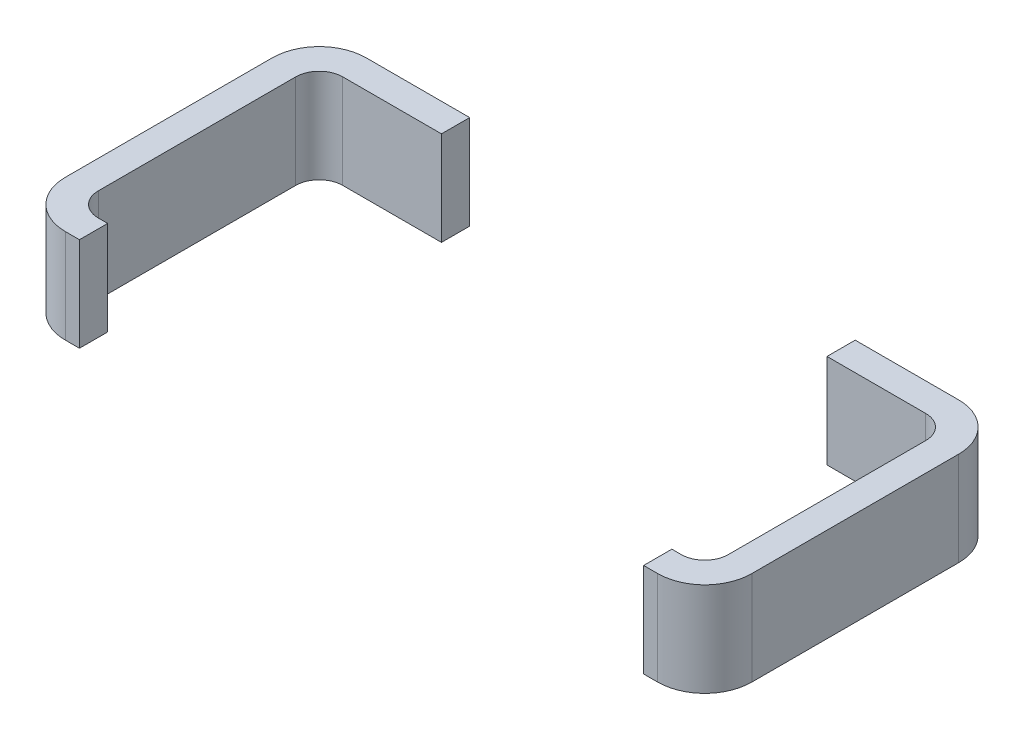
ISO-10303-21;
HEADER;
FILE_DESCRIPTION(('STEP AP214'),'2;1');
FILE_NAME('part.step','',(''),(''),'','','');
FILE_SCHEMA(('AUTOMOTIVE_DESIGN { 1 0 10303 214 1 1 1 1 }'));
ENDSEC;
DATA;
#1=APPLICATION_CONTEXT('core data for automotive mechanical design processes');
#2=APPLICATION_PROTOCOL_DEFINITION('international standard','automotive_design',2000,#1);
#3=PRODUCT_CONTEXT('',#1,'mechanical');
#4=PRODUCT('Part','Part','',(#3));
#5=PRODUCT_RELATED_PRODUCT_CATEGORY('part','',(#4));
#6=PRODUCT_DEFINITION_FORMATION('','',#4);
#7=PRODUCT_DEFINITION_CONTEXT('part definition',#1,'design');
#8=PRODUCT_DEFINITION('design','',#6,#7);
#9=PRODUCT_DEFINITION_SHAPE('','',#8);
#10=(LENGTH_UNIT() NAMED_UNIT(*) SI_UNIT(.MILLI.,.METRE.));
#11=(NAMED_UNIT(*) PLANE_ANGLE_UNIT() SI_UNIT($,.RADIAN.));
#12=(NAMED_UNIT(*) SI_UNIT($,.STERADIAN.) SOLID_ANGLE_UNIT());
#13=UNCERTAINTY_MEASURE_WITH_UNIT(LENGTH_MEASURE(1.E-05),#10,'distance_accuracy_value','');
#14=(GEOMETRIC_REPRESENTATION_CONTEXT(3) GLOBAL_UNCERTAINTY_ASSIGNED_CONTEXT((#13)) GLOBAL_UNIT_ASSIGNED_CONTEXT((#10,
#11,#12)) REPRESENTATION_CONTEXT('',''));
#15=CARTESIAN_POINT('',(0.,0.,0.));
#16=DIRECTION('',(0.,0.,1.));
#17=DIRECTION('',(1.,0.,0.));
#18=AXIS2_PLACEMENT_3D('',#15,#16,#17);
#19=CARTESIAN_POINT('',(-1.825,0.,1.6));
#20=DIRECTION('',(0.,0.,1.));
#21=DIRECTION('',(1.,0.,0.));
#22=AXIS2_PLACEMENT_3D('',#19,#20,#21);
#23=PLANE('',#22);
#24=DIRECTION('',(0.,1.,0.));
#25=VECTOR('',#24,1.);
#26=CARTESIAN_POINT('',(-1.5,0.,1.6));
#27=LINE('',#26,#25);
#28=CARTESIAN_POINT('',(-1.5,0.25,1.6));
#29=VERTEX_POINT('',#28);
#30=CARTESIAN_POINT('',(-1.5,-0.25,1.6));
#31=VERTEX_POINT('',#30);
#32=EDGE_CURVE('P0_E154',#29,#31,#27,.F.);
#33=ORIENTED_EDGE('',*,*,#32,.F.);
#34=DIRECTION('',(1.,0.,0.));
#35=VECTOR('',#34,1.);
#36=CARTESIAN_POINT('',(-1.425,0.25,1.6));
#37=LINE('',#36,#35);
#38=CARTESIAN_POINT('',(-1.575,0.25,1.6));
#39=VERTEX_POINT('',#38);
#40=EDGE_CURVE('P0_E161',#39,#29,#37,.T.);
#41=ORIENTED_EDGE('',*,*,#40,.F.);
#42=DIRECTION('',(0.,1.,0.));
#43=VECTOR('',#42,1.);
#44=CARTESIAN_POINT('',(-1.575,0.,1.6));
#45=LINE('',#44,#43);
#46=CARTESIAN_POINT('',(-1.575,-0.25,1.6));
#47=VERTEX_POINT('',#46);
#48=EDGE_CURVE('P0_E168',#47,#39,#45,.T.);
#49=ORIENTED_EDGE('',*,*,#48,.F.);
#50=DIRECTION('',(1.,0.,0.));
#51=VECTOR('',#50,1.);
#52=CARTESIAN_POINT('',(-1.425,-0.25,1.6));
#53=LINE('',#52,#51);
#54=EDGE_CURVE('P0_E102',#31,#47,#53,.F.);
#55=ORIENTED_EDGE('',*,*,#54,.F.);
#56=EDGE_LOOP('',(#33,#41,#49,#55));
#57=FACE_BOUND('',#56,.T.);
#58=ADVANCED_FACE('P0_F17',(#57),#23,.T.);
#59=CARTESIAN_POINT('',(-1.5,0.,1.6));
#60=DIRECTION('',(1.,0.,0.));
#61=DIRECTION('',(0.,0.,-1.));
#62=AXIS2_PLACEMENT_3D('',#59,#60,#61);
#63=PLANE('',#62);
#64=ORIENTED_EDGE('',*,*,#32,.T.);
#65=DIRECTION('',(0.,0.,-1.));
#66=VECTOR('',#65,1.);
#67=CARTESIAN_POINT('',(-1.5,-0.25,0.8));
#68=LINE('',#67,#66);
#69=CARTESIAN_POINT('',(-1.5,-0.25,1.45));
#70=VERTEX_POINT('',#69);
#71=EDGE_CURVE('P0_E104',#70,#31,#68,.F.);
#72=ORIENTED_EDGE('',*,*,#71,.F.);
#73=DIRECTION('',(0.,1.,0.));
#74=VECTOR('',#73,1.);
#75=CARTESIAN_POINT('',(-1.5,0.,1.45));
#76=LINE('',#75,#74);
#77=CARTESIAN_POINT('',(-1.5,0.25,1.45));
#78=VERTEX_POINT('',#77);
#79=EDGE_CURVE('P0_E151',#78,#70,#76,.F.);
#80=ORIENTED_EDGE('',*,*,#79,.F.);
#81=DIRECTION('',(0.,0.,1.));
#82=VECTOR('',#81,1.);
#83=CARTESIAN_POINT('',(-1.5,0.25,0.8));
#84=LINE('',#83,#82);
#85=EDGE_CURVE('P0_E157',#29,#78,#84,.F.);
#86=ORIENTED_EDGE('',*,*,#85,.F.);
#87=EDGE_LOOP('',(#64,#72,#80,#86));
#88=FACE_BOUND('',#87,.T.);
#89=ADVANCED_FACE('P0_F223',(#88),#63,.T.);
#90=CARTESIAN_POINT('',(-1.5,0.,1.45));
#91=DIRECTION('',(0.,0.,-1.));
#92=DIRECTION('',(-1.,0.,0.));
#93=AXIS2_PLACEMENT_3D('',#90,#91,#92);
#94=PLANE('',#93);
#95=ORIENTED_EDGE('',*,*,#79,.T.);
#96=DIRECTION('',(1.,0.,0.));
#97=VECTOR('',#96,1.);
#98=CARTESIAN_POINT('',(-1.425,-0.25,1.45));
#99=LINE('',#98,#97);
#100=CARTESIAN_POINT('',(-1.55,-0.25,1.45));
#101=VERTEX_POINT('',#100);
#102=EDGE_CURVE('P0_E107',#101,#70,#99,.T.);
#103=ORIENTED_EDGE('',*,*,#102,.F.);
#104=DIRECTION('',(0.,1.,0.));
#105=VECTOR('',#104,1.);
#106=CARTESIAN_POINT('',(-1.55,0.,1.45));
#107=LINE('',#106,#105);
#108=CARTESIAN_POINT('',(-1.55,0.25,1.45));
#109=VERTEX_POINT('',#108);
#110=EDGE_CURVE('P0_E148',#101,#109,#107,.T.);
#111=ORIENTED_EDGE('',*,*,#110,.T.);
#112=DIRECTION('',(1.,0.,0.));
#113=VECTOR('',#112,1.);
#114=CARTESIAN_POINT('',(-1.425,0.25,1.45));
#115=LINE('',#114,#113);
#116=EDGE_CURVE('P0_E160',#78,#109,#115,.F.);
#117=ORIENTED_EDGE('',*,*,#116,.F.);
#118=EDGE_LOOP('',(#95,#103,#111,#117));
#119=FACE_BOUND('',#118,.T.);
#120=ADVANCED_FACE('P0_F215',(#119),#94,.T.);
#121=CARTESIAN_POINT('',(-1.55,0.,1.325));
#122=DIRECTION('',(0.,1.,0.));
#123=DIRECTION('',(0.,0.,1.));
#124=AXIS2_PLACEMENT_3D('',#121,#122,#123);
#125=CYLINDRICAL_SURFACE('',#124,0.125);
#126=DIRECTION('',(0.,1.,0.));
#127=VECTOR('',#126,1.);
#128=CARTESIAN_POINT('',(-1.675,0.,1.325));
#129=LINE('',#128,#127);
#130=CARTESIAN_POINT('',(-1.675,0.25,1.325));
#131=VERTEX_POINT('',#130);
#132=CARTESIAN_POINT('',(-1.675,-0.25,1.325));
#133=VERTEX_POINT('',#132);
#134=EDGE_CURVE('P0_E146',#131,#133,#129,.F.);
#135=ORIENTED_EDGE('',*,*,#134,.F.);
#136=CARTESIAN_POINT('',(-1.55,0.25,1.325));
#137=DIRECTION('',(0.,1.,0.));
#138=DIRECTION('',(0.,0.,1.));
#139=AXIS2_PLACEMENT_3D('',#136,#137,#138);
#140=CIRCLE('',#139,0.125);
#141=EDGE_CURVE('P0_E184',#109,#131,#140,.F.);
#142=ORIENTED_EDGE('',*,*,#141,.F.);
#143=ORIENTED_EDGE('',*,*,#110,.F.);
#144=CARTESIAN_POINT('',(-1.55,-0.25,1.325));
#145=DIRECTION('',(0.,1.,0.));
#146=DIRECTION('',(0.,0.,1.));
#147=AXIS2_PLACEMENT_3D('',#144,#145,#146);
#148=CIRCLE('',#147,0.125);
#149=EDGE_CURVE('P0_E110',#133,#101,#148,.T.);
#150=ORIENTED_EDGE('',*,*,#149,.F.);
#151=EDGE_LOOP('',(#135,#142,#143,#150));
#152=FACE_BOUND('',#151,.T.);
#153=ADVANCED_FACE('P0_F210',(#152),#125,.F.);
#154=CARTESIAN_POINT('',(-1.675,0.,1.45));
#155=DIRECTION('',(1.,0.,0.));
#156=DIRECTION('',(0.,0.,-1.));
#157=AXIS2_PLACEMENT_3D('',#154,#155,#156);
#158=PLANE('',#157);
#159=DIRECTION('',(0.,1.,0.));
#160=VECTOR('',#159,1.);
#161=CARTESIAN_POINT('',(-1.675,0.,0.275));
#162=LINE('',#161,#160);
#163=CARTESIAN_POINT('',(-1.675,-0.25,0.275));
#164=VERTEX_POINT('',#163);
#165=CARTESIAN_POINT('',(-1.675,0.25,0.275));
#166=VERTEX_POINT('',#165);
#167=EDGE_CURVE('P0_E143',#164,#166,#162,.T.);
#168=ORIENTED_EDGE('',*,*,#167,.T.);
#169=DIRECTION('',(0.,0.,1.));
#170=VECTOR('',#169,1.);
#171=CARTESIAN_POINT('',(-1.675,0.25,0.8));
#172=LINE('',#171,#170);
#173=EDGE_CURVE('P0_E183',#131,#166,#172,.F.);
#174=ORIENTED_EDGE('',*,*,#173,.F.);
#175=ORIENTED_EDGE('',*,*,#134,.T.);
#176=DIRECTION('',(0.,0.,-1.));
#177=VECTOR('',#176,1.);
#178=CARTESIAN_POINT('',(-1.675,-0.25,0.8));
#179=LINE('',#178,#177);
#180=EDGE_CURVE('P0_E113',#164,#133,#179,.F.);
#181=ORIENTED_EDGE('',*,*,#180,.F.);
#182=EDGE_LOOP('',(#168,#174,#175,#181));
#183=FACE_BOUND('',#182,.T.);
#184=ADVANCED_FACE('P0_F205',(#183),#158,.T.);
#185=CARTESIAN_POINT('',(-1.55,0.,0.275));
#186=DIRECTION('',(0.,1.,0.));
#187=DIRECTION('',(0.,0.,1.));
#188=AXIS2_PLACEMENT_3D('',#185,#186,#187);
#189=CYLINDRICAL_SURFACE('',#188,0.125);
#190=DIRECTION('',(0.,1.,0.));
#191=VECTOR('',#190,1.);
#192=CARTESIAN_POINT('',(-1.55,0.,0.15));
#193=LINE('',#192,#191);
#194=CARTESIAN_POINT('',(-1.55,0.25,0.15));
#195=VERTEX_POINT('',#194);
#196=CARTESIAN_POINT('',(-1.55,-0.25,0.15));
#197=VERTEX_POINT('',#196);
#198=EDGE_CURVE('P0_E139',#195,#197,#193,.F.);
#199=ORIENTED_EDGE('',*,*,#198,.F.);
#200=CARTESIAN_POINT('',(-1.55,0.25,0.275));
#201=DIRECTION('',(0.,1.,0.));
#202=DIRECTION('',(0.,0.,1.));
#203=AXIS2_PLACEMENT_3D('',#200,#201,#202);
#204=CIRCLE('',#203,0.125);
#205=EDGE_CURVE('P0_E180',#166,#195,#204,.F.);
#206=ORIENTED_EDGE('',*,*,#205,.F.);
#207=ORIENTED_EDGE('',*,*,#167,.F.);
#208=CARTESIAN_POINT('',(-1.55,-0.25,0.275));
#209=DIRECTION('',(0.,1.,0.));
#210=DIRECTION('',(0.,0.,1.));
#211=AXIS2_PLACEMENT_3D('',#208,#209,#210);
#212=CIRCLE('',#211,0.125);
#213=EDGE_CURVE('P0_E116',#197,#164,#212,.T.);
#214=ORIENTED_EDGE('',*,*,#213,.F.);
#215=EDGE_LOOP('',(#199,#206,#207,#214));
#216=FACE_BOUND('',#215,.T.);
#217=ADVANCED_FACE('P0_F197',(#216),#189,.F.);
#218=CARTESIAN_POINT('',(-1.675,0.,0.15));
#219=DIRECTION('',(0.,0.,1.));
#220=DIRECTION('',(1.,0.,0.));
#221=AXIS2_PLACEMENT_3D('',#218,#219,#220);
#222=PLANE('',#221);
#223=DIRECTION('',(0.,1.,0.));
#224=VECTOR('',#223,1.);
#225=CARTESIAN_POINT('',(-1.025,0.,0.15));
#226=LINE('',#225,#224);
#227=CARTESIAN_POINT('',(-1.025,0.25,0.15));
#228=VERTEX_POINT('',#227);
#229=CARTESIAN_POINT('',(-1.025,-0.25,0.15));
#230=VERTEX_POINT('',#229);
#231=EDGE_CURVE('P0_E129',#228,#230,#226,.F.);
#232=ORIENTED_EDGE('',*,*,#231,.F.);
#233=DIRECTION('',(1.,0.,0.));
#234=VECTOR('',#233,1.);
#235=CARTESIAN_POINT('',(-1.425,0.25,0.15));
#236=LINE('',#235,#234);
#237=EDGE_CURVE('P0_E134',#195,#228,#236,.T.);
#238=ORIENTED_EDGE('',*,*,#237,.F.);
#239=ORIENTED_EDGE('',*,*,#198,.T.);
#240=DIRECTION('',(1.,0.,0.));
#241=VECTOR('',#240,1.);
#242=CARTESIAN_POINT('',(-1.425,-0.25,0.15));
#243=LINE('',#242,#241);
#244=EDGE_CURVE('P0_E117',#230,#197,#243,.F.);
#245=ORIENTED_EDGE('',*,*,#244,.F.);
#246=EDGE_LOOP('',(#232,#238,#239,#245));
#247=FACE_BOUND('',#246,.T.);
#248=ADVANCED_FACE('P0_F252',(#247),#222,.T.);
#249=CARTESIAN_POINT('',(-1.025,0.,0.15));
#250=DIRECTION('',(1.,0.,0.));
#251=DIRECTION('',(0.,0.,-1.));
#252=AXIS2_PLACEMENT_3D('',#249,#250,#251);
#253=PLANE('',#252);
#254=ORIENTED_EDGE('',*,*,#231,.T.);
#255=DIRECTION('',(0.,0.,-1.));
#256=VECTOR('',#255,1.);
#257=CARTESIAN_POINT('',(-1.025,-0.25,0.8));
#258=LINE('',#257,#256);
#259=CARTESIAN_POINT('',(-1.025,-0.25,0.));
#260=VERTEX_POINT('',#259);
#261=EDGE_CURVE('P0_E120',#260,#230,#258,.F.);
#262=ORIENTED_EDGE('',*,*,#261,.F.);
#263=DIRECTION('',(0.,1.,0.));
#264=VECTOR('',#263,1.);
#265=CARTESIAN_POINT('',(-1.025,0.,0.));
#266=LINE('',#265,#264);
#267=CARTESIAN_POINT('',(-1.025,0.25,0.));
#268=VERTEX_POINT('',#267);
#269=EDGE_CURVE('P0_E126',#268,#260,#266,.F.);
#270=ORIENTED_EDGE('',*,*,#269,.F.);
#271=DIRECTION('',(0.,0.,1.));
#272=VECTOR('',#271,1.);
#273=CARTESIAN_POINT('',(-1.025,0.25,0.8));
#274=LINE('',#273,#272);
#275=EDGE_CURVE('P0_E98',#228,#268,#274,.F.);
#276=ORIENTED_EDGE('',*,*,#275,.F.);
#277=EDGE_LOOP('',(#254,#262,#270,#276));
#278=FACE_BOUND('',#277,.T.);
#279=ADVANCED_FACE('P0_F267',(#278),#253,.T.);
#280=CARTESIAN_POINT('',(-1.025,0.,0.));
#281=DIRECTION('',(0.,0.,-1.));
#282=DIRECTION('',(-1.,0.,0.));
#283=AXIS2_PLACEMENT_3D('',#280,#281,#282);
#284=PLANE('',#283);
#285=ORIENTED_EDGE('',*,*,#269,.T.);
#286=DIRECTION('',(1.,0.,0.));
#287=VECTOR('',#286,1.);
#288=CARTESIAN_POINT('',(-1.425,-0.25,0.));
#289=LINE('',#288,#287);
#290=CARTESIAN_POINT('',(-1.575,-0.25,0.));
#291=VERTEX_POINT('',#290);
#292=EDGE_CURVE('P0_E85',#291,#260,#289,.T.);
#293=ORIENTED_EDGE('',*,*,#292,.F.);
#294=DIRECTION('',(0.,1.,0.));
#295=VECTOR('',#294,1.);
#296=CARTESIAN_POINT('',(-1.575,0.,0.));
#297=LINE('',#296,#295);
#298=CARTESIAN_POINT('',(-1.575,0.25,0.));
#299=VERTEX_POINT('',#298);
#300=EDGE_CURVE('P0_E81',#299,#291,#297,.F.);
#301=ORIENTED_EDGE('',*,*,#300,.F.);
#302=DIRECTION('',(1.,0.,0.));
#303=VECTOR('',#302,1.);
#304=CARTESIAN_POINT('',(-1.425,0.25,0.));
#305=LINE('',#304,#303);
#306=EDGE_CURVE('P0_E95',#268,#299,#305,.F.);
#307=ORIENTED_EDGE('',*,*,#306,.F.);
#308=EDGE_LOOP('',(#285,#293,#301,#307));
#309=FACE_BOUND('',#308,.T.);
#310=ADVANCED_FACE('P0_F265',(#309),#284,.T.);
#311=CARTESIAN_POINT('',(-1.575,0.,0.25));
#312=DIRECTION('',(0.,1.,0.));
#313=DIRECTION('',(0.,0.,1.));
#314=AXIS2_PLACEMENT_3D('',#311,#312,#313);
#315=CYLINDRICAL_SURFACE('',#314,0.25);
#316=CARTESIAN_POINT('',(-1.575,-0.25,0.25));
#317=DIRECTION('',(0.,1.,0.));
#318=DIRECTION('',(0.,0.,1.));
#319=AXIS2_PLACEMENT_3D('',#316,#317,#318);
#320=CIRCLE('',#319,0.25);
#321=CARTESIAN_POINT('',(-1.825,-0.25,0.25));
#322=VERTEX_POINT('',#321);
#323=EDGE_CURVE('P0_E20',#322,#291,#320,.F.);
#324=ORIENTED_EDGE('',*,*,#323,.F.);
#325=DIRECTION('',(0.,1.,0.));
#326=VECTOR('',#325,1.);
#327=CARTESIAN_POINT('',(-1.825,0.,0.25));
#328=LINE('',#327,#326);
#329=CARTESIAN_POINT('',(-1.825,0.25,0.25));
#330=VERTEX_POINT('',#329);
#331=EDGE_CURVE('P0_E79',#330,#322,#328,.F.);
#332=ORIENTED_EDGE('',*,*,#331,.F.);
#333=CARTESIAN_POINT('',(-1.575,0.25,0.25));
#334=DIRECTION('',(0.,1.,0.));
#335=DIRECTION('',(0.,0.,1.));
#336=AXIS2_PLACEMENT_3D('',#333,#334,#335);
#337=CIRCLE('',#336,0.25);
#338=EDGE_CURVE('P0_E170',#299,#330,#337,.T.);
#339=ORIENTED_EDGE('',*,*,#338,.F.);
#340=ORIENTED_EDGE('',*,*,#300,.T.);
#341=EDGE_LOOP('',(#324,#332,#339,#340));
#342=FACE_BOUND('',#341,.T.);
#343=ADVANCED_FACE('P0_F76',(#342),#315,.T.);
#344=CARTESIAN_POINT('',(-1.425,-0.25,0.8));
#345=DIRECTION('',(0.,-1.,0.));
#346=DIRECTION('',(0.,0.,-1.));
#347=AXIS2_PLACEMENT_3D('',#344,#345,#346);
#348=PLANE('',#347);
#349=CARTESIAN_POINT('',(-1.575,-0.25,1.35));
#350=DIRECTION('',(0.,1.,0.));
#351=DIRECTION('',(0.,0.,1.));
#352=AXIS2_PLACEMENT_3D('',#349,#350,#351);
#353=CIRCLE('',#352,0.25);
#354=CARTESIAN_POINT('',(-1.825,-0.25,1.35));
#355=VERTEX_POINT('',#354);
#356=EDGE_CURVE('P0_E90',#355,#47,#353,.T.);
#357=ORIENTED_EDGE('',*,*,#356,.F.);
#358=DIRECTION('',(0.,0.,1.));
#359=VECTOR('',#358,1.);
#360=CARTESIAN_POINT('',(-1.825,-0.25,0.));
#361=LINE('',#360,#359);
#362=EDGE_CURVE('P0_E87',#322,#355,#361,.T.);
#363=ORIENTED_EDGE('',*,*,#362,.F.);
#364=ORIENTED_EDGE('',*,*,#323,.T.);
#365=ORIENTED_EDGE('',*,*,#292,.T.);
#366=ORIENTED_EDGE('',*,*,#261,.T.);
#367=ORIENTED_EDGE('',*,*,#244,.T.);
#368=ORIENTED_EDGE('',*,*,#213,.T.);
#369=ORIENTED_EDGE('',*,*,#180,.T.);
#370=ORIENTED_EDGE('',*,*,#149,.T.);
#371=ORIENTED_EDGE('',*,*,#102,.T.);
#372=ORIENTED_EDGE('',*,*,#71,.T.);
#373=ORIENTED_EDGE('',*,*,#54,.T.);
#374=EDGE_LOOP('',(#357,#363,#364,#365,#366,#367,#368,#369,#370,#371,#372,#373));
#375=FACE_BOUND('',#374,.T.);
#376=ADVANCED_FACE('P0_F88',(#375),#348,.T.);
#377=CARTESIAN_POINT('',(-1.575,0.,1.35));
#378=DIRECTION('',(0.,1.,0.));
#379=DIRECTION('',(0.,0.,1.));
#380=AXIS2_PLACEMENT_3D('',#377,#378,#379);
#381=CYLINDRICAL_SURFACE('',#380,0.25);
#382=ORIENTED_EDGE('',*,*,#356,.T.);
#383=ORIENTED_EDGE('',*,*,#48,.T.);
#384=CARTESIAN_POINT('',(-1.575,0.25,1.35));
#385=DIRECTION('',(0.,1.,0.));
#386=DIRECTION('',(0.,0.,1.));
#387=AXIS2_PLACEMENT_3D('',#384,#385,#386);
#388=CIRCLE('',#387,0.25);
#389=CARTESIAN_POINT('',(-1.825,0.25,1.35));
#390=VERTEX_POINT('',#389);
#391=EDGE_CURVE('P0_E35',#390,#39,#388,.T.);
#392=ORIENTED_EDGE('',*,*,#391,.F.);
#393=DIRECTION('',(0.,1.,0.));
#394=VECTOR('',#393,1.);
#395=CARTESIAN_POINT('',(-1.825,0.,1.35));
#396=LINE('',#395,#394);
#397=EDGE_CURVE('P0_E26',#355,#390,#396,.T.);
#398=ORIENTED_EDGE('',*,*,#397,.F.);
#399=EDGE_LOOP('',(#382,#383,#392,#398));
#400=FACE_BOUND('',#399,.T.);
#401=ADVANCED_FACE('P0_F231',(#400),#381,.T.);
#402=CARTESIAN_POINT('',(-1.425,0.25,0.8));
#403=DIRECTION('',(0.,1.,0.));
#404=DIRECTION('',(0.,0.,1.));
#405=AXIS2_PLACEMENT_3D('',#402,#403,#404);
#406=PLANE('',#405);
#407=ORIENTED_EDGE('',*,*,#275,.T.);
#408=ORIENTED_EDGE('',*,*,#306,.T.);
#409=ORIENTED_EDGE('',*,*,#338,.T.);
#410=DIRECTION('',(0.,0.,1.));
#411=VECTOR('',#410,1.);
#412=CARTESIAN_POINT('',(-1.825,0.25,0.));
#413=LINE('',#412,#411);
#414=EDGE_CURVE('P0_E11',#390,#330,#413,.F.);
#415=ORIENTED_EDGE('',*,*,#414,.F.);
#416=ORIENTED_EDGE('',*,*,#391,.T.);
#417=ORIENTED_EDGE('',*,*,#40,.T.);
#418=ORIENTED_EDGE('',*,*,#85,.T.);
#419=ORIENTED_EDGE('',*,*,#116,.T.);
#420=ORIENTED_EDGE('',*,*,#141,.T.);
#421=ORIENTED_EDGE('',*,*,#173,.T.);
#422=ORIENTED_EDGE('',*,*,#205,.T.);
#423=ORIENTED_EDGE('',*,*,#237,.T.);
#424=EDGE_LOOP('',(#407,#408,#409,#415,#416,#417,#418,#419,#420,#421,#422,#423));
#425=FACE_BOUND('',#424,.T.);
#426=ADVANCED_FACE('P0_F247',(#425),#406,.T.);
#427=CARTESIAN_POINT('',(-1.825,0.,0.));
#428=DIRECTION('',(-1.,0.,0.));
#429=DIRECTION('',(0.,0.,1.));
#430=AXIS2_PLACEMENT_3D('',#427,#428,#429);
#431=PLANE('',#430);
#432=ORIENTED_EDGE('',*,*,#397,.T.);
#433=ORIENTED_EDGE('',*,*,#414,.T.);
#434=ORIENTED_EDGE('',*,*,#331,.T.);
#435=ORIENTED_EDGE('',*,*,#362,.T.);
#436=EDGE_LOOP('',(#432,#433,#434,#435));
#437=FACE_BOUND('',#436,.T.);
#438=ADVANCED_FACE('P0_F94',(#437),#431,.T.);
#439=CLOSED_SHELL('',(#58,#89,#120,#153,#184,#217,#248,#279,#310,#343,#376,#401,#426,#438));
#440=MANIFOLD_SOLID_BREP('P0_B1',#439);
#441=CARTESIAN_POINT('',(1.825,0.,1.6));
#442=DIRECTION('',(0.,0.,-1.));
#443=DIRECTION('',(-1.,0.,0.));
#444=AXIS2_PLACEMENT_3D('',#441,#442,#443);
#445=PLANE('',#444);
#446=DIRECTION('',(1.,0.,0.));
#447=VECTOR('',#446,1.);
#448=CARTESIAN_POINT('',(1.425,0.25,1.6));
#449=LINE('',#448,#447);
#450=CARTESIAN_POINT('',(1.575,0.25,1.6));
#451=VERTEX_POINT('',#450);
#452=CARTESIAN_POINT('',(1.5,0.25,1.6));
#453=VERTEX_POINT('',#452);
#454=EDGE_CURVE('P1_E163',#451,#453,#449,.F.);
#455=ORIENTED_EDGE('',*,*,#454,.T.);
#456=DIRECTION('',(0.,1.,0.));
#457=VECTOR('',#456,1.);
#458=CARTESIAN_POINT('',(1.5,0.,1.6));
#459=LINE('',#458,#457);
#460=CARTESIAN_POINT('',(1.5,-0.25,1.6));
#461=VERTEX_POINT('',#460);
#462=EDGE_CURVE('P1_E156',#453,#461,#459,.F.);
#463=ORIENTED_EDGE('',*,*,#462,.T.);
#464=DIRECTION('',(1.,0.,0.));
#465=VECTOR('',#464,1.);
#466=CARTESIAN_POINT('',(1.425,-0.25,1.6));
#467=LINE('',#466,#465);
#468=CARTESIAN_POINT('',(1.575,-0.25,1.6));
#469=VERTEX_POINT('',#468);
#470=EDGE_CURVE('P1_E172',#461,#469,#467,.T.);
#471=ORIENTED_EDGE('',*,*,#470,.T.);
#472=DIRECTION('',(0.,-1.,0.));
#473=VECTOR('',#472,1.);
#474=CARTESIAN_POINT('',(1.575,0.,1.6));
#475=LINE('',#474,#473);
#476=EDGE_CURVE('P1_E169',#451,#469,#475,.T.);
#477=ORIENTED_EDGE('',*,*,#476,.F.);
#478=EDGE_LOOP('',(#455,#463,#471,#477));
#479=FACE_BOUND('',#478,.T.);
#480=ADVANCED_FACE('P1_F17',(#479),#445,.F.);
#481=CARTESIAN_POINT('',(1.5,0.,1.6));
#482=DIRECTION('',(1.,0.,0.));
#483=DIRECTION('',(0.,0.,-1.));
#484=AXIS2_PLACEMENT_3D('',#481,#482,#483);
#485=PLANE('',#484);
#486=DIRECTION('',(0.,0.,1.));
#487=VECTOR('',#486,1.);
#488=CARTESIAN_POINT('',(1.5,-0.25,0.8));
#489=LINE('',#488,#487);
#490=CARTESIAN_POINT('',(1.5,-0.25,1.45));
#491=VERTEX_POINT('',#490);
#492=EDGE_CURVE('P1_E173',#491,#461,#489,.T.);
#493=ORIENTED_EDGE('',*,*,#492,.T.);
#494=ORIENTED_EDGE('',*,*,#462,.F.);
#495=DIRECTION('',(0.,0.,-1.));
#496=VECTOR('',#495,1.);
#497=CARTESIAN_POINT('',(1.5,0.25,0.8));
#498=LINE('',#497,#496);
#499=CARTESIAN_POINT('',(1.5,0.25,1.45));
#500=VERTEX_POINT('',#499);
#501=EDGE_CURVE('P1_E159',#453,#500,#498,.T.);
#502=ORIENTED_EDGE('',*,*,#501,.T.);
#503=DIRECTION('',(0.,1.,0.));
#504=VECTOR('',#503,1.);
#505=CARTESIAN_POINT('',(1.5,0.,1.45));
#506=LINE('',#505,#504);
#507=EDGE_CURVE('P1_E154',#500,#491,#506,.F.);
#508=ORIENTED_EDGE('',*,*,#507,.T.);
#509=EDGE_LOOP('',(#493,#494,#502,#508));
#510=FACE_BOUND('',#509,.T.);
#511=ADVANCED_FACE('P1_F263',(#510),#485,.F.);
#512=CARTESIAN_POINT('',(1.5,0.,1.45));
#513=DIRECTION('',(0.,0.,1.));
#514=DIRECTION('',(1.,0.,0.));
#515=AXIS2_PLACEMENT_3D('',#512,#513,#514);
#516=PLANE('',#515);
#517=DIRECTION('',(1.,0.,0.));
#518=VECTOR('',#517,1.);
#519=CARTESIAN_POINT('',(1.425,-0.25,1.45));
#520=LINE('',#519,#518);
#521=CARTESIAN_POINT('',(1.55,-0.25,1.45));
#522=VERTEX_POINT('',#521);
#523=EDGE_CURVE('P1_E176',#522,#491,#520,.F.);
#524=ORIENTED_EDGE('',*,*,#523,.T.);
#525=ORIENTED_EDGE('',*,*,#507,.F.);
#526=DIRECTION('',(1.,0.,0.));
#527=VECTOR('',#526,1.);
#528=CARTESIAN_POINT('',(1.425,0.25,1.45));
#529=LINE('',#528,#527);
#530=CARTESIAN_POINT('',(1.55,0.25,1.45));
#531=VERTEX_POINT('',#530);
#532=EDGE_CURVE('P1_E162',#500,#531,#529,.T.);
#533=ORIENTED_EDGE('',*,*,#532,.T.);
#534=DIRECTION('',(0.,-1.,0.));
#535=VECTOR('',#534,1.);
#536=CARTESIAN_POINT('',(1.55,0.,1.45));
#537=LINE('',#536,#535);
#538=EDGE_CURVE('P1_E152',#531,#522,#537,.T.);
#539=ORIENTED_EDGE('',*,*,#538,.T.);
#540=EDGE_LOOP('',(#524,#525,#533,#539));
#541=FACE_BOUND('',#540,.T.);
#542=ADVANCED_FACE('P1_F261',(#541),#516,.F.);
#543=CARTESIAN_POINT('',(1.55,0.,1.325));
#544=DIRECTION('',(0.,-1.,0.));
#545=DIRECTION('',(0.,0.,-1.));
#546=AXIS2_PLACEMENT_3D('',#543,#544,#545);
#547=CYLINDRICAL_SURFACE('',#546,0.125);
#548=ORIENTED_EDGE('',*,*,#538,.F.);
#549=CARTESIAN_POINT('',(1.55,0.25,1.325));
#550=DIRECTION('',(0.,-1.,0.));
#551=DIRECTION('',(0.,0.,-1.));
#552=AXIS2_PLACEMENT_3D('',#549,#550,#551);
#553=CIRCLE('',#552,0.125);
#554=CARTESIAN_POINT('',(1.675,0.25,1.325));
#555=VERTEX_POINT('',#554);
#556=EDGE_CURVE('P1_E190',#531,#555,#553,.F.);
#557=ORIENTED_EDGE('',*,*,#556,.T.);
#558=DIRECTION('',(0.,1.,0.));
#559=VECTOR('',#558,1.);
#560=CARTESIAN_POINT('',(1.675,0.,1.325));
#561=LINE('',#560,#559);
#562=CARTESIAN_POINT('',(1.675,-0.25,1.325));
#563=VERTEX_POINT('',#562);
#564=EDGE_CURVE('P1_E150',#555,#563,#561,.F.);
#565=ORIENTED_EDGE('',*,*,#564,.T.);
#566=CARTESIAN_POINT('',(1.55,-0.25,1.325));
#567=DIRECTION('',(0.,-1.,0.));
#568=DIRECTION('',(0.,0.,-1.));
#569=AXIS2_PLACEMENT_3D('',#566,#567,#568);
#570=CIRCLE('',#569,0.125);
#571=EDGE_CURVE('P1_E196',#563,#522,#570,.T.);
#572=ORIENTED_EDGE('',*,*,#571,.T.);
#573=EDGE_LOOP('',(#548,#557,#565,#572));
#574=FACE_BOUND('',#573,.T.);
#575=ADVANCED_FACE('P1_F258',(#574),#547,.F.);
#576=CARTESIAN_POINT('',(1.675,0.,1.45));
#577=DIRECTION('',(1.,0.,0.));
#578=DIRECTION('',(0.,0.,-1.));
#579=AXIS2_PLACEMENT_3D('',#576,#577,#578);
#580=PLANE('',#579);
#581=DIRECTION('',(0.,0.,-1.));
#582=VECTOR('',#581,1.);
#583=CARTESIAN_POINT('',(1.675,0.25,0.8));
#584=LINE('',#583,#582);
#585=CARTESIAN_POINT('',(1.675,0.25,0.275));
#586=VERTEX_POINT('',#585);
#587=EDGE_CURVE('P1_E189',#555,#586,#584,.T.);
#588=ORIENTED_EDGE('',*,*,#587,.T.);
#589=DIRECTION('',(0.,-1.,0.));
#590=VECTOR('',#589,1.);
#591=CARTESIAN_POINT('',(1.675,0.,0.275));
#592=LINE('',#591,#590);
#593=CARTESIAN_POINT('',(1.675,-0.25,0.275));
#594=VERTEX_POINT('',#593);
#595=EDGE_CURVE('P1_E148',#586,#594,#592,.T.);
#596=ORIENTED_EDGE('',*,*,#595,.T.);
#597=DIRECTION('',(0.,0.,1.));
#598=VECTOR('',#597,1.);
#599=CARTESIAN_POINT('',(1.675,-0.25,0.8));
#600=LINE('',#599,#598);
#601=EDGE_CURVE('P1_E198',#594,#563,#600,.T.);
#602=ORIENTED_EDGE('',*,*,#601,.T.);
#603=ORIENTED_EDGE('',*,*,#564,.F.);
#604=EDGE_LOOP('',(#588,#596,#602,#603));
#605=FACE_BOUND('',#604,.T.);
#606=ADVANCED_FACE('P1_F254',(#605),#580,.F.);
#607=CARTESIAN_POINT('',(1.55,0.,0.275));
#608=DIRECTION('',(0.,-1.,0.));
#609=DIRECTION('',(0.,0.,-1.));
#610=AXIS2_PLACEMENT_3D('',#607,#608,#609);
#611=CYLINDRICAL_SURFACE('',#610,0.125);
#612=ORIENTED_EDGE('',*,*,#595,.F.);
#613=CARTESIAN_POINT('',(1.55,0.25,0.275));
#614=DIRECTION('',(0.,-1.,0.));
#615=DIRECTION('',(0.,0.,-1.));
#616=AXIS2_PLACEMENT_3D('',#613,#614,#615);
#617=CIRCLE('',#616,0.125);
#618=CARTESIAN_POINT('',(1.55,0.25,0.15));
#619=VERTEX_POINT('',#618);
#620=EDGE_CURVE('P1_E137',#586,#619,#617,.F.);
#621=ORIENTED_EDGE('',*,*,#620,.T.);
#622=DIRECTION('',(0.,1.,0.));
#623=VECTOR('',#622,1.);
#624=CARTESIAN_POINT('',(1.55,0.,0.15));
#625=LINE('',#624,#623);
#626=CARTESIAN_POINT('',(1.55,-0.25,0.15));
#627=VERTEX_POINT('',#626);
#628=EDGE_CURVE('P1_E80',#619,#627,#625,.F.);
#629=ORIENTED_EDGE('',*,*,#628,.T.);
#630=CARTESIAN_POINT('',(1.55,-0.25,0.275));
#631=DIRECTION('',(0.,-1.,0.));
#632=DIRECTION('',(0.,0.,-1.));
#633=AXIS2_PLACEMENT_3D('',#630,#631,#632);
#634=CIRCLE('',#633,0.125);
#635=EDGE_CURVE('P1_E20',#627,#594,#634,.T.);
#636=ORIENTED_EDGE('',*,*,#635,.T.);
#637=EDGE_LOOP('',(#612,#621,#629,#636));
#638=FACE_BOUND('',#637,.T.);
#639=ADVANCED_FACE('P1_F293',(#638),#611,.F.);
#640=CARTESIAN_POINT('',(1.675,0.,0.15));
#641=DIRECTION('',(0.,0.,-1.));
#642=DIRECTION('',(-1.,0.,0.));
#643=AXIS2_PLACEMENT_3D('',#640,#641,#642);
#644=PLANE('',#643);
#645=DIRECTION('',(1.,0.,0.));
#646=VECTOR('',#645,1.);
#647=CARTESIAN_POINT('',(1.425,0.25,0.15));
#648=LINE('',#647,#646);
#649=CARTESIAN_POINT('',(1.025,0.25,0.15));
#650=VERTEX_POINT('',#649);
#651=EDGE_CURVE('P1_E135',#619,#650,#648,.F.);
#652=ORIENTED_EDGE('',*,*,#651,.T.);
#653=DIRECTION('',(0.,1.,0.));
#654=VECTOR('',#653,1.);
#655=CARTESIAN_POINT('',(1.025,0.,0.15));
#656=LINE('',#655,#654);
#657=CARTESIAN_POINT('',(1.025,-0.25,0.15));
#658=VERTEX_POINT('',#657);
#659=EDGE_CURVE('P1_E90',#650,#658,#656,.F.);
#660=ORIENTED_EDGE('',*,*,#659,.T.);
#661=DIRECTION('',(1.,0.,0.));
#662=VECTOR('',#661,1.);
#663=CARTESIAN_POINT('',(1.425,-0.25,0.15));
#664=LINE('',#663,#662);
#665=EDGE_CURVE('P1_E181',#658,#627,#664,.T.);
#666=ORIENTED_EDGE('',*,*,#665,.T.);
#667=ORIENTED_EDGE('',*,*,#628,.F.);
#668=EDGE_LOOP('',(#652,#660,#666,#667));
#669=FACE_BOUND('',#668,.T.);
#670=ADVANCED_FACE('P1_F290',(#669),#644,.F.);
#671=CARTESIAN_POINT('',(1.025,0.,0.15));
#672=DIRECTION('',(1.,0.,0.));
#673=DIRECTION('',(0.,0.,-1.));
#674=AXIS2_PLACEMENT_3D('',#671,#672,#673);
#675=PLANE('',#674);
#676=DIRECTION('',(0.,0.,1.));
#677=VECTOR('',#676,1.);
#678=CARTESIAN_POINT('',(1.025,-0.25,0.8));
#679=LINE('',#678,#677);
#680=CARTESIAN_POINT('',(1.025,-0.25,0.));
#681=VERTEX_POINT('',#680);
#682=EDGE_CURVE('P1_E179',#681,#658,#679,.T.);
#683=ORIENTED_EDGE('',*,*,#682,.T.);
#684=ORIENTED_EDGE('',*,*,#659,.F.);
#685=DIRECTION('',(0.,0.,-1.));
#686=VECTOR('',#685,1.);
#687=CARTESIAN_POINT('',(1.025,0.25,0.8));
#688=LINE('',#687,#686);
#689=CARTESIAN_POINT('',(1.025,0.25,0.));
#690=VERTEX_POINT('',#689);
#691=EDGE_CURVE('P1_E131',#650,#690,#688,.T.);
#692=ORIENTED_EDGE('',*,*,#691,.T.);
#693=DIRECTION('',(0.,1.,0.));
#694=VECTOR('',#693,1.);
#695=CARTESIAN_POINT('',(1.025,0.,0.));
#696=LINE('',#695,#694);
#697=EDGE_CURVE('P1_E121',#690,#681,#696,.F.);
#698=ORIENTED_EDGE('',*,*,#697,.T.);
#699=EDGE_LOOP('',(#683,#684,#692,#698));
#700=FACE_BOUND('',#699,.T.);
#701=ADVANCED_FACE('P1_F134',(#700),#675,.F.);
#702=CARTESIAN_POINT('',(1.025,0.,0.));
#703=DIRECTION('',(0.,0.,1.));
#704=DIRECTION('',(1.,0.,0.));
#705=AXIS2_PLACEMENT_3D('',#702,#703,#704);
#706=PLANE('',#705);
#707=DIRECTION('',(1.,0.,0.));
#708=VECTOR('',#707,1.);
#709=CARTESIAN_POINT('',(1.425,-0.25,0.));
#710=LINE('',#709,#708);
#711=CARTESIAN_POINT('',(1.575,-0.25,0.));
#712=VERTEX_POINT('',#711);
#713=EDGE_CURVE('P1_E113',#712,#681,#710,.F.);
#714=ORIENTED_EDGE('',*,*,#713,.T.);
#715=ORIENTED_EDGE('',*,*,#697,.F.);
#716=DIRECTION('',(1.,0.,0.));
#717=VECTOR('',#716,1.);
#718=CARTESIAN_POINT('',(1.425,0.25,0.));
#719=LINE('',#718,#717);
#720=CARTESIAN_POINT('',(1.575,0.25,0.));
#721=VERTEX_POINT('',#720);
#722=EDGE_CURVE('P1_E120',#690,#721,#719,.T.);
#723=ORIENTED_EDGE('',*,*,#722,.T.);
#724=DIRECTION('',(0.,-1.,0.));
#725=VECTOR('',#724,1.);
#726=CARTESIAN_POINT('',(1.575,0.,0.));
#727=LINE('',#726,#725);
#728=EDGE_CURVE('P1_E186',#712,#721,#727,.F.);
#729=ORIENTED_EDGE('',*,*,#728,.F.);
#730=EDGE_LOOP('',(#714,#715,#723,#729));
#731=FACE_BOUND('',#730,.T.);
#732=ADVANCED_FACE('P1_F122',(#731),#706,.F.);
#733=CARTESIAN_POINT('',(1.425,-0.25,0.8));
#734=DIRECTION('',(0.,1.,0.));
#735=DIRECTION('',(0.,0.,1.));
#736=AXIS2_PLACEMENT_3D('',#733,#734,#735);
#737=PLANE('',#736);
#738=DIRECTION('',(0.,0.,1.));
#739=VECTOR('',#738,1.);
#740=CARTESIAN_POINT('',(1.825,-0.25,0.));
#741=LINE('',#740,#739);
#742=CARTESIAN_POINT('',(1.825,-0.25,0.25));
#743=VERTEX_POINT('',#742);
#744=CARTESIAN_POINT('',(1.825,-0.25,1.35));
#745=VERTEX_POINT('',#744);
#746=EDGE_CURVE('P1_E216',#743,#745,#741,.T.);
#747=ORIENTED_EDGE('',*,*,#746,.T.);
#748=CARTESIAN_POINT('',(1.575,-0.25,1.35));
#749=DIRECTION('',(0.,-1.,0.));
#750=DIRECTION('',(0.,0.,-1.));
#751=AXIS2_PLACEMENT_3D('',#748,#749,#750);
#752=CIRCLE('',#751,0.25);
#753=EDGE_CURVE('P1_E171',#469,#745,#752,.F.);
#754=ORIENTED_EDGE('',*,*,#753,.F.);
#755=ORIENTED_EDGE('',*,*,#470,.F.);
#756=ORIENTED_EDGE('',*,*,#492,.F.);
#757=ORIENTED_EDGE('',*,*,#523,.F.);
#758=ORIENTED_EDGE('',*,*,#571,.F.);
#759=ORIENTED_EDGE('',*,*,#601,.F.);
#760=ORIENTED_EDGE('',*,*,#635,.F.);
#761=ORIENTED_EDGE('',*,*,#665,.F.);
#762=ORIENTED_EDGE('',*,*,#682,.F.);
#763=ORIENTED_EDGE('',*,*,#713,.F.);
#764=CARTESIAN_POINT('',(1.575,-0.25,0.25));
#765=DIRECTION('',(0.,-1.,0.));
#766=DIRECTION('',(0.,0.,-1.));
#767=AXIS2_PLACEMENT_3D('',#764,#765,#766);
#768=CIRCLE('',#767,0.25);
#769=EDGE_CURVE('P1_E184',#743,#712,#768,.F.);
#770=ORIENTED_EDGE('',*,*,#769,.F.);
#771=EDGE_LOOP('',(#747,#754,#755,#756,#757,#758,#759,#760,#761,#762,#763,#770));
#772=FACE_BOUND('',#771,.T.);
#773=ADVANCED_FACE('P1_F233',(#772),#737,.F.);
#774=CARTESIAN_POINT('',(1.575,0.,1.35));
#775=DIRECTION('',(0.,-1.,0.));
#776=DIRECTION('',(0.,0.,-1.));
#777=AXIS2_PLACEMENT_3D('',#774,#775,#776);
#778=CYLINDRICAL_SURFACE('',#777,0.25);
#779=ORIENTED_EDGE('',*,*,#753,.T.);
#780=DIRECTION('',(0.,1.,0.));
#781=VECTOR('',#780,1.);
#782=CARTESIAN_POINT('',(1.825,0.,1.35));
#783=LINE('',#782,#781);
#784=CARTESIAN_POINT('',(1.825,0.25,1.35));
#785=VERTEX_POINT('',#784);
#786=EDGE_CURVE('P1_E218',#745,#785,#783,.T.);
#787=ORIENTED_EDGE('',*,*,#786,.T.);
#788=CARTESIAN_POINT('',(1.575,0.25,1.35));
#789=DIRECTION('',(0.,-1.,0.));
#790=DIRECTION('',(0.,0.,-1.));
#791=AXIS2_PLACEMENT_3D('',#788,#789,#790);
#792=CIRCLE('',#791,0.25);
#793=EDGE_CURVE('P1_E193',#785,#451,#792,.T.);
#794=ORIENTED_EDGE('',*,*,#793,.T.);
#795=ORIENTED_EDGE('',*,*,#476,.T.);
#796=EDGE_LOOP('',(#779,#787,#794,#795));
#797=FACE_BOUND('',#796,.T.);
#798=ADVANCED_FACE('P1_F236',(#797),#778,.T.);
#799=CARTESIAN_POINT('',(1.425,0.25,0.8));
#800=DIRECTION('',(0.,-1.,0.));
#801=DIRECTION('',(0.,0.,-1.));
#802=AXIS2_PLACEMENT_3D('',#799,#800,#801);
#803=PLANE('',#802);
#804=ORIENTED_EDGE('',*,*,#722,.F.);
#805=ORIENTED_EDGE('',*,*,#691,.F.);
#806=ORIENTED_EDGE('',*,*,#651,.F.);
#807=ORIENTED_EDGE('',*,*,#620,.F.);
#808=ORIENTED_EDGE('',*,*,#587,.F.);
#809=ORIENTED_EDGE('',*,*,#556,.F.);
#810=ORIENTED_EDGE('',*,*,#532,.F.);
#811=ORIENTED_EDGE('',*,*,#501,.F.);
#812=ORIENTED_EDGE('',*,*,#454,.F.);
#813=ORIENTED_EDGE('',*,*,#793,.F.);
#814=DIRECTION('',(0.,0.,1.));
#815=VECTOR('',#814,1.);
#816=CARTESIAN_POINT('',(1.825,0.25,0.));
#817=LINE('',#816,#815);
#818=CARTESIAN_POINT('',(1.825,0.25,0.25));
#819=VERTEX_POINT('',#818);
#820=EDGE_CURVE('P1_E26',#785,#819,#817,.F.);
#821=ORIENTED_EDGE('',*,*,#820,.T.);
#822=CARTESIAN_POINT('',(1.575,0.25,0.25));
#823=DIRECTION('',(0.,-1.,0.));
#824=DIRECTION('',(0.,0.,-1.));
#825=AXIS2_PLACEMENT_3D('',#822,#823,#824);
#826=CIRCLE('',#825,0.25);
#827=EDGE_CURVE('P1_E34',#721,#819,#826,.T.);
#828=ORIENTED_EDGE('',*,*,#827,.F.);
#829=EDGE_LOOP('',(#804,#805,#806,#807,#808,#809,#810,#811,#812,#813,#821,#828));
#830=FACE_BOUND('',#829,.T.);
#831=ADVANCED_FACE('P1_F129',(#830),#803,.F.);
#832=CARTESIAN_POINT('',(1.575,0.,0.25));
#833=DIRECTION('',(0.,-1.,0.));
#834=DIRECTION('',(0.,0.,-1.));
#835=AXIS2_PLACEMENT_3D('',#832,#833,#834);
#836=CYLINDRICAL_SURFACE('',#835,0.25);
#837=ORIENTED_EDGE('',*,*,#769,.T.);
#838=ORIENTED_EDGE('',*,*,#728,.T.);
#839=ORIENTED_EDGE('',*,*,#827,.T.);
#840=DIRECTION('',(0.,1.,0.));
#841=VECTOR('',#840,1.);
#842=CARTESIAN_POINT('',(1.825,0.,0.25));
#843=LINE('',#842,#841);
#844=EDGE_CURVE('P1_E11',#819,#743,#843,.F.);
#845=ORIENTED_EDGE('',*,*,#844,.T.);
#846=EDGE_LOOP('',(#837,#838,#839,#845));
#847=FACE_BOUND('',#846,.T.);
#848=ADVANCED_FACE('P1_F273',(#847),#836,.T.);
#849=CARTESIAN_POINT('',(1.825,0.,0.));
#850=DIRECTION('',(-1.,0.,0.));
#851=DIRECTION('',(0.,0.,1.));
#852=AXIS2_PLACEMENT_3D('',#849,#850,#851);
#853=PLANE('',#852);
#854=ORIENTED_EDGE('',*,*,#820,.F.);
#855=ORIENTED_EDGE('',*,*,#786,.F.);
#856=ORIENTED_EDGE('',*,*,#746,.F.);
#857=ORIENTED_EDGE('',*,*,#844,.F.);
#858=EDGE_LOOP('',(#854,#855,#856,#857));
#859=FACE_BOUND('',#858,.T.);
#860=ADVANCED_FACE('P1_F239',(#859),#853,.F.);
#861=CLOSED_SHELL('',(#480,#511,#542,#575,#606,#639,#670,#701,#732,#773,#798,#831,#848,#860));
#862=MANIFOLD_SOLID_BREP('P1_B1',#861);
#863=ADVANCED_BREP_SHAPE_REPRESENTATION('',(#18,#440,#862),#14);
#864=SHAPE_DEFINITION_REPRESENTATION(#9,#863);
ENDSEC;
END-ISO-10303-21;
